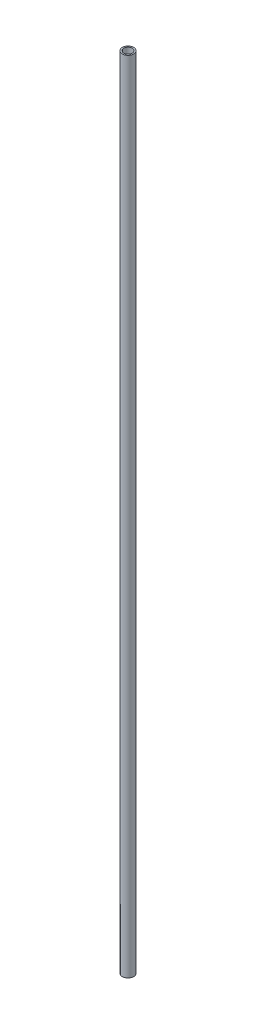
ISO-10303-21;
HEADER;
FILE_DESCRIPTION(('STEP AP214'),'2;1');
FILE_NAME('part.step','',(''),(''),'','','');
FILE_SCHEMA(('AUTOMOTIVE_DESIGN { 1 0 10303 214 1 1 1 1 }'));
ENDSEC;
DATA;
#1=APPLICATION_CONTEXT('core data for automotive mechanical design processes');
#2=APPLICATION_PROTOCOL_DEFINITION('international standard','automotive_design',2000,#1);
#3=PRODUCT_CONTEXT('',#1,'mechanical');
#4=PRODUCT('Part','Part','',(#3));
#5=PRODUCT_RELATED_PRODUCT_CATEGORY('part','',(#4));
#6=PRODUCT_DEFINITION_FORMATION('','',#4);
#7=PRODUCT_DEFINITION_CONTEXT('part definition',#1,'design');
#8=PRODUCT_DEFINITION('design','',#6,#7);
#9=PRODUCT_DEFINITION_SHAPE('','',#8);
#10=(LENGTH_UNIT() NAMED_UNIT(*) SI_UNIT(.MILLI.,.METRE.));
#11=(NAMED_UNIT(*) PLANE_ANGLE_UNIT() SI_UNIT($,.RADIAN.));
#12=(NAMED_UNIT(*) SI_UNIT($,.STERADIAN.) SOLID_ANGLE_UNIT());
#13=UNCERTAINTY_MEASURE_WITH_UNIT(LENGTH_MEASURE(1.E-05),#10,'distance_accuracy_value','');
#14=(GEOMETRIC_REPRESENTATION_CONTEXT(3) GLOBAL_UNCERTAINTY_ASSIGNED_CONTEXT((#13)) GLOBAL_UNIT_ASSIGNED_CONTEXT((#10,
#11,#12)) REPRESENTATION_CONTEXT('',''));
#15=CARTESIAN_POINT('',(0.,0.,0.));
#16=DIRECTION('',(0.,0.,1.));
#17=DIRECTION('',(1.,0.,0.));
#18=AXIS2_PLACEMENT_3D('',#15,#16,#17);
#19=CARTESIAN_POINT('',(0.,140.,0.));
#20=DIRECTION('',(0.,1.,0.));
#21=DIRECTION('',(0.,0.,1.));
#22=AXIS2_PLACEMENT_3D('',#19,#20,#21);
#23=PLANE('',#22);
#24=CARTESIAN_POINT('',(0.,140.,0.));
#25=DIRECTION('',(0.,1.,0.));
#26=DIRECTION('',(0.,0.,1.));
#27=AXIS2_PLACEMENT_3D('',#24,#25,#26);
#28=CIRCLE('',#27,1.);
#29=CARTESIAN_POINT('',(0.,140.,1.));
#30=VERTEX_POINT('',#29);
#31=EDGE_CURVE('E10',#30,#30,#28,.T.);
#32=ORIENTED_EDGE('',*,*,#31,.T.);
#33=EDGE_LOOP('',(#32));
#34=FACE_BOUND('',#33,.T.);
#35=CARTESIAN_POINT('',(0.,140.,0.));
#36=DIRECTION('',(0.,1.,0.));
#37=DIRECTION('',(0.,0.,1.));
#38=AXIS2_PLACEMENT_3D('',#35,#36,#37);
#39=CIRCLE('',#38,0.75);
#40=CARTESIAN_POINT('',(0.,140.,0.75));
#41=VERTEX_POINT('',#40);
#42=EDGE_CURVE('E41',#41,#41,#39,.T.);
#43=ORIENTED_EDGE('',*,*,#42,.F.);
#44=EDGE_LOOP('',(#43));
#45=FACE_BOUND('',#44,.T.);
#46=ADVANCED_FACE('F30',(#34,#45),#23,.T.);
#47=CARTESIAN_POINT('',(0.,0.,0.));
#48=DIRECTION('',(0.,1.,0.));
#49=DIRECTION('',(0.,0.,1.));
#50=AXIS2_PLACEMENT_3D('',#47,#48,#49);
#51=PLANE('',#50);
#52=CARTESIAN_POINT('',(0.,0.,0.));
#53=DIRECTION('',(0.,1.,0.));
#54=DIRECTION('',(0.,0.,1.));
#55=AXIS2_PLACEMENT_3D('',#52,#53,#54);
#56=CIRCLE('',#55,1.);
#57=CARTESIAN_POINT('',(0.,0.,1.));
#58=VERTEX_POINT('',#57);
#59=EDGE_CURVE('E34',#58,#58,#56,.T.);
#60=ORIENTED_EDGE('',*,*,#59,.F.);
#61=EDGE_LOOP('',(#60));
#62=FACE_BOUND('',#61,.T.);
#63=CARTESIAN_POINT('',(0.,0.,0.));
#64=DIRECTION('',(0.,1.,0.));
#65=DIRECTION('',(0.,0.,1.));
#66=AXIS2_PLACEMENT_3D('',#63,#64,#65);
#67=CIRCLE('',#66,0.75);
#68=CARTESIAN_POINT('',(0.,0.,0.75));
#69=VERTEX_POINT('',#68);
#70=EDGE_CURVE('E43',#69,#69,#67,.T.);
#71=ORIENTED_EDGE('',*,*,#70,.T.);
#72=EDGE_LOOP('',(#71));
#73=FACE_BOUND('',#72,.T.);
#74=ADVANCED_FACE('F53',(#62,#73),#51,.F.);
#75=CARTESIAN_POINT('',(0.,140.,0.));
#76=DIRECTION('',(0.,-1.,0.));
#77=DIRECTION('',(0.,0.,-1.));
#78=AXIS2_PLACEMENT_3D('',#75,#76,#77);
#79=CYLINDRICAL_SURFACE('',#78,1.);
#80=ORIENTED_EDGE('',*,*,#31,.F.);
#81=EDGE_LOOP('',(#80));
#82=FACE_BOUND('',#81,.T.);
#83=ORIENTED_EDGE('',*,*,#59,.T.);
#84=EDGE_LOOP('',(#83));
#85=FACE_BOUND('',#84,.T.);
#86=ADVANCED_FACE('F32',(#82,#85),#79,.T.);
#87=CARTESIAN_POINT('',(0.,140.,0.));
#88=DIRECTION('',(0.,-1.,0.));
#89=DIRECTION('',(0.,0.,-1.));
#90=AXIS2_PLACEMENT_3D('',#87,#88,#89);
#91=CYLINDRICAL_SURFACE('',#90,0.75);
#92=ORIENTED_EDGE('',*,*,#42,.T.);
#93=EDGE_LOOP('',(#92));
#94=FACE_BOUND('',#93,.T.);
#95=ORIENTED_EDGE('',*,*,#70,.F.);
#96=EDGE_LOOP('',(#95));
#97=FACE_BOUND('',#96,.T.);
#98=ADVANCED_FACE('F49',(#94,#97),#91,.F.);
#99=CLOSED_SHELL('',(#46,#74,#86,#98));
#100=MANIFOLD_SOLID_BREP('B2',#99);
#101=ADVANCED_BREP_SHAPE_REPRESENTATION('',(#18,#100),#14);
#102=SHAPE_DEFINITION_REPRESENTATION(#9,#101);
ENDSEC;
END-ISO-10303-21;
